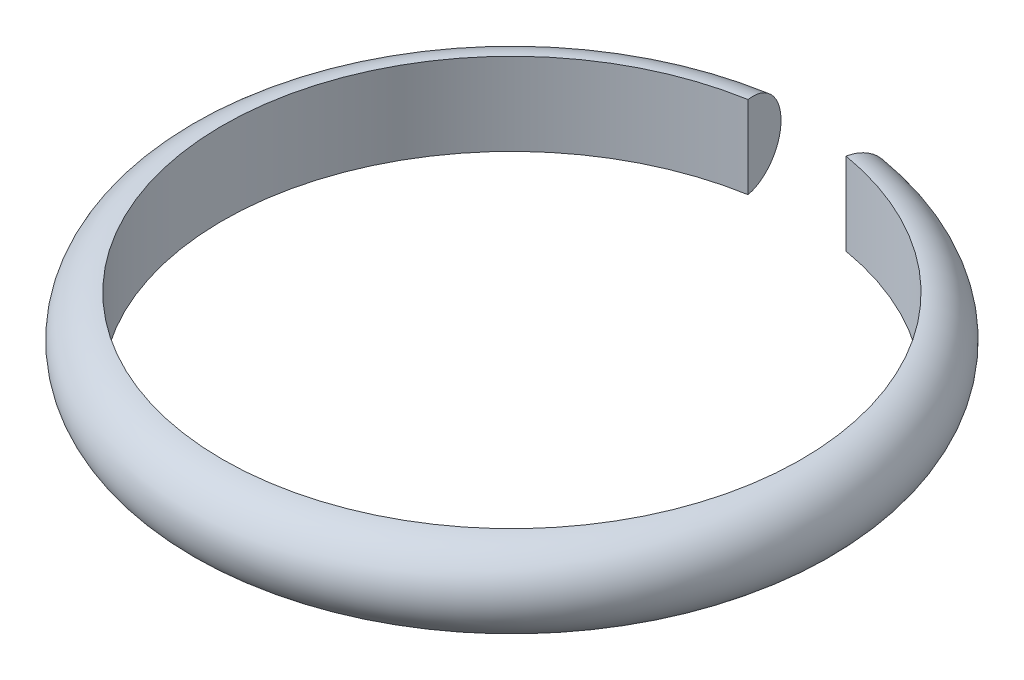
ISO-10303-21;
HEADER;
FILE_DESCRIPTION(('STEP AP214'),'2;1');
FILE_NAME('part.step','',(''),(''),'','','');
FILE_SCHEMA(('AUTOMOTIVE_DESIGN { 1 0 10303 214 1 1 1 1 }'));
ENDSEC;
DATA;
#1=APPLICATION_CONTEXT('core data for automotive mechanical design processes');
#2=APPLICATION_PROTOCOL_DEFINITION('international standard','automotive_design',2000,#1);
#3=PRODUCT_CONTEXT('',#1,'mechanical');
#4=PRODUCT('Part','Part','',(#3));
#5=PRODUCT_RELATED_PRODUCT_CATEGORY('part','',(#4));
#6=PRODUCT_DEFINITION_FORMATION('','',#4);
#7=PRODUCT_DEFINITION_CONTEXT('part definition',#1,'design');
#8=PRODUCT_DEFINITION('design','',#6,#7);
#9=PRODUCT_DEFINITION_SHAPE('','',#8);
#10=(LENGTH_UNIT() NAMED_UNIT(*) SI_UNIT(.MILLI.,.METRE.));
#11=(NAMED_UNIT(*) PLANE_ANGLE_UNIT() SI_UNIT($,.RADIAN.));
#12=(NAMED_UNIT(*) SI_UNIT($,.STERADIAN.) SOLID_ANGLE_UNIT());
#13=UNCERTAINTY_MEASURE_WITH_UNIT(LENGTH_MEASURE(1.E-05),#10,'distance_accuracy_value','');
#14=(GEOMETRIC_REPRESENTATION_CONTEXT(3) GLOBAL_UNCERTAINTY_ASSIGNED_CONTEXT((#13)) GLOBAL_UNIT_ASSIGNED_CONTEXT((#10,
#11,#12)) REPRESENTATION_CONTEXT('',''));
#15=CARTESIAN_POINT('',(0.,0.,0.));
#16=DIRECTION('',(0.,0.,1.));
#17=DIRECTION('',(1.,0.,0.));
#18=AXIS2_PLACEMENT_3D('',#15,#16,#17);
#19=CARTESIAN_POINT('',(0.,0.,0.));
#20=DIRECTION('',(0.,1.,0.));
#21=DIRECTION('',(0.,0.,1.));
#22=AXIS2_PLACEMENT_3D('',#19,#20,#21);
#23=TOROIDAL_SURFACE('',#22,35.,5.);
#24=CARTESIAN_POINT('',(0.,4.99899989997999,0.));
#25=DIRECTION('',(0.,-1.,0.));
#26=DIRECTION('',(0.,0.,-1.));
#27=AXIS2_PLACEMENT_3D('',#24,#25,#26);
#28=CIRCLE('',#27,35.1);
#29=CARTESIAN_POINT('',(-5.94397663472739,4.99899989997999,-34.5930504836711));
#30=VERTEX_POINT('',#29);
#31=CARTESIAN_POINT('',(5.94397663472741,4.99899989997999,-34.5930504836711));
#32=VERTEX_POINT('',#31);
#33=EDGE_CURVE('E12',#30,#32,#28,.F.);
#34=ORIENTED_EDGE('',*,*,#33,.F.);
#35=CARTESIAN_POINT('',(-5.92704222836065,0.,-34.4944947842874));
#36=DIRECTION('',(-0.985556993836783,0.,0.169344063667447));
#37=DIRECTION('',(0.169344063667447,0.,0.985556993836783));
#38=AXIS2_PLACEMENT_3D('',#35,#36,#37);
#39=CIRCLE('',#38,5.);
#40=CARTESIAN_POINT('',(-5.94397663472739,-4.99899989997999,-34.5930504836711));
#41=VERTEX_POINT('',#40);
#42=EDGE_CURVE('E81',#30,#41,#39,.T.);
#43=ORIENTED_EDGE('',*,*,#42,.T.);
#44=CARTESIAN_POINT('',(0.,-4.99899989997999,0.));
#45=DIRECTION('',(0.,1.,0.));
#46=DIRECTION('',(0.,0.,1.));
#47=AXIS2_PLACEMENT_3D('',#44,#45,#46);
#48=CIRCLE('',#47,35.1);
#49=CARTESIAN_POINT('',(5.94397663472742,-4.99899989997999,-34.5930504836711));
#50=VERTEX_POINT('',#49);
#51=EDGE_CURVE('E57',#50,#41,#48,.F.);
#52=ORIENTED_EDGE('',*,*,#51,.F.);
#53=CARTESIAN_POINT('',(5.92704222836067,0.,-34.4944947842874));
#54=DIRECTION('',(-0.985556993836783,0.,-0.169344063667448));
#55=DIRECTION('',(-0.169344063667448,0.,0.985556993836783));
#56=AXIS2_PLACEMENT_3D('',#53,#54,#55);
#57=CIRCLE('',#56,5.);
#58=EDGE_CURVE('E78',#32,#50,#57,.T.);
#59=ORIENTED_EDGE('',*,*,#58,.F.);
#60=EDGE_LOOP('',(#34,#43,#52,#59));
#61=FACE_BOUND('',#60,.T.);
#62=ADVANCED_FACE('F49',(#61),#23,.T.);
#63=CARTESIAN_POINT('',(-5.92704222836065,0.,-34.4944947842874));
#64=DIRECTION('',(-0.985556993836783,0.,0.169344063667447));
#65=DIRECTION('',(0.169344063667447,0.,0.985556993836783));
#66=AXIS2_PLACEMENT_3D('',#63,#64,#65);
#67=PLANE('',#66);
#68=ORIENTED_EDGE('',*,*,#42,.F.);
#69=DIRECTION('',(0.,1.,0.));
#70=VECTOR('',#69,1.);
#71=CARTESIAN_POINT('',(-5.94397663472739,-5.,-34.5930504836711));
#72=LINE('',#71,#70);
#73=EDGE_CURVE('E68',#30,#41,#72,.F.);
#74=ORIENTED_EDGE('',*,*,#73,.T.);
#75=EDGE_LOOP('',(#68,#74));
#76=FACE_BOUND('',#75,.T.);
#77=ADVANCED_FACE('F51',(#76),#67,.F.);
#78=CARTESIAN_POINT('',(5.92704222836067,0.,-34.4944947842874));
#79=DIRECTION('',(-0.985556993836783,0.,-0.169344063667448));
#80=DIRECTION('',(-0.169344063667448,0.,0.985556993836783));
#81=AXIS2_PLACEMENT_3D('',#78,#79,#80);
#82=PLANE('',#81);
#83=DIRECTION('',(0.,1.,0.));
#84=VECTOR('',#83,1.);
#85=CARTESIAN_POINT('',(5.94397663472741,-5.,-34.5930504836711));
#86=LINE('',#85,#84);
#87=EDGE_CURVE('E63',#32,#50,#86,.F.);
#88=ORIENTED_EDGE('',*,*,#87,.F.);
#89=ORIENTED_EDGE('',*,*,#58,.T.);
#90=EDGE_LOOP('',(#88,#89));
#91=FACE_BOUND('',#90,.T.);
#92=ADVANCED_FACE('F87',(#91),#82,.T.);
#93=CARTESIAN_POINT('',(0.,-5.,0.));
#94=DIRECTION('',(0.,1.,0.));
#95=DIRECTION('',(0.,0.,1.));
#96=AXIS2_PLACEMENT_3D('',#93,#94,#95);
#97=CYLINDRICAL_SURFACE('',#96,35.1);
#98=ORIENTED_EDGE('',*,*,#33,.T.);
#99=ORIENTED_EDGE('',*,*,#87,.T.);
#100=ORIENTED_EDGE('',*,*,#51,.T.);
#101=ORIENTED_EDGE('',*,*,#73,.F.);
#102=EDGE_LOOP('',(#98,#99,#100,#101));
#103=FACE_BOUND('',#102,.T.);
#104=ADVANCED_FACE('F73',(#103),#97,.F.);
#105=CLOSED_SHELL('',(#62,#77,#92,#104));
#106=MANIFOLD_SOLID_BREP('B2',#105);
#107=ADVANCED_BREP_SHAPE_REPRESENTATION('',(#18,#106),#14);
#108=SHAPE_DEFINITION_REPRESENTATION(#9,#107);
ENDSEC;
END-ISO-10303-21;
